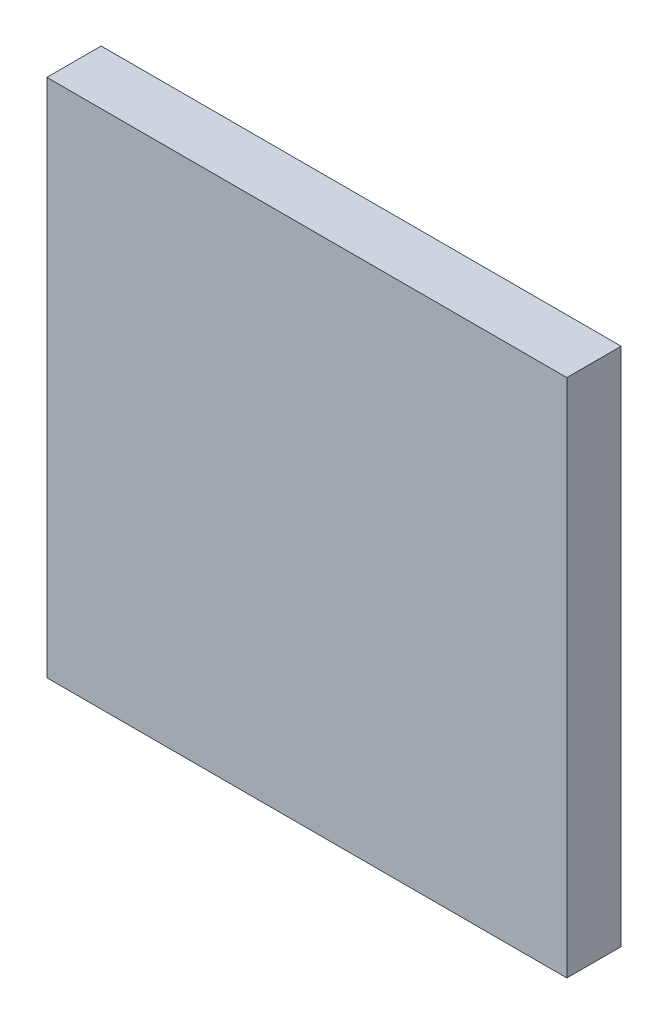
ISO-10303-21;
HEADER;
FILE_DESCRIPTION(('STEP AP214'),'2;1');
FILE_NAME('part.step','',(''),(''),'','','');
FILE_SCHEMA(('AUTOMOTIVE_DESIGN { 1 0 10303 214 1 1 1 1 }'));
ENDSEC;
DATA;
#1=APPLICATION_CONTEXT('core data for automotive mechanical design processes');
#2=APPLICATION_PROTOCOL_DEFINITION('international standard','automotive_design',2000,#1);
#3=PRODUCT_CONTEXT('',#1,'mechanical');
#4=PRODUCT('Part','Part','',(#3));
#5=PRODUCT_RELATED_PRODUCT_CATEGORY('part','',(#4));
#6=PRODUCT_DEFINITION_FORMATION('','',#4);
#7=PRODUCT_DEFINITION_CONTEXT('part definition',#1,'design');
#8=PRODUCT_DEFINITION('design','',#6,#7);
#9=PRODUCT_DEFINITION_SHAPE('','',#8);
#10=(LENGTH_UNIT() NAMED_UNIT(*) SI_UNIT(.MILLI.,.METRE.));
#11=(NAMED_UNIT(*) PLANE_ANGLE_UNIT() SI_UNIT($,.RADIAN.));
#12=(NAMED_UNIT(*) SI_UNIT($,.STERADIAN.) SOLID_ANGLE_UNIT());
#13=UNCERTAINTY_MEASURE_WITH_UNIT(LENGTH_MEASURE(1.E-05),#10,'distance_accuracy_value','');
#14=(GEOMETRIC_REPRESENTATION_CONTEXT(3) GLOBAL_UNCERTAINTY_ASSIGNED_CONTEXT((#13)) GLOBAL_UNIT_ASSIGNED_CONTEXT((#10,
#11,#12)) REPRESENTATION_CONTEXT('',''));
#15=CARTESIAN_POINT('',(0.,0.,0.));
#16=DIRECTION('',(0.,0.,1.));
#17=DIRECTION('',(1.,0.,0.));
#18=AXIS2_PLACEMENT_3D('',#15,#16,#17);
#19=CARTESIAN_POINT('',(-4.5,4.5,0.9398));
#20=DIRECTION('',(1.,0.,0.));
#21=DIRECTION('',(0.,1.,0.));
#22=AXIS2_PLACEMENT_3D('',#19,#20,#21);
#23=PLANE('',#22);
#24=DIRECTION('',(0.,-1.,0.));
#25=VECTOR('',#24,1.);
#26=CARTESIAN_POINT('',(-4.5,4.5,0.));
#27=LINE('',#26,#25);
#28=CARTESIAN_POINT('',(-4.5,4.5,0.));
#29=VERTEX_POINT('',#28);
#30=CARTESIAN_POINT('',(-4.5,-4.5,0.));
#31=VERTEX_POINT('',#30);
#32=EDGE_CURVE('E106',#29,#31,#27,.T.);
#33=ORIENTED_EDGE('',*,*,#32,.T.);
#34=DIRECTION('',(0.,0.,-1.));
#35=VECTOR('',#34,1.);
#36=CARTESIAN_POINT('',(-4.5,-4.5,0.9398));
#37=LINE('',#36,#35);
#38=CARTESIAN_POINT('',(-4.5,-4.5,0.9398));
#39=VERTEX_POINT('',#38);
#40=EDGE_CURVE('E11',#39,#31,#37,.T.);
#41=ORIENTED_EDGE('',*,*,#40,.F.);
#42=DIRECTION('',(0.,-1.,0.));
#43=VECTOR('',#42,1.);
#44=CARTESIAN_POINT('',(-4.5,4.5,0.9398));
#45=LINE('',#44,#43);
#46=CARTESIAN_POINT('',(-4.5,4.5,0.9398));
#47=VERTEX_POINT('',#46);
#48=EDGE_CURVE('E90',#47,#39,#45,.T.);
#49=ORIENTED_EDGE('',*,*,#48,.F.);
#50=DIRECTION('',(0.,0.,-1.));
#51=VECTOR('',#50,1.);
#52=CARTESIAN_POINT('',(-4.5,4.5,0.9398));
#53=LINE('',#52,#51);
#54=EDGE_CURVE('E102',#47,#29,#53,.T.);
#55=ORIENTED_EDGE('',*,*,#54,.T.);
#56=EDGE_LOOP('',(#33,#41,#49,#55));
#57=FACE_BOUND('',#56,.T.);
#58=ADVANCED_FACE('F39',(#57),#23,.F.);
#59=CARTESIAN_POINT('',(-4.5,-4.5,0.9398));
#60=DIRECTION('',(0.,1.,0.));
#61=DIRECTION('',(0.,0.,1.));
#62=AXIS2_PLACEMENT_3D('',#59,#60,#61);
#63=PLANE('',#62);
#64=DIRECTION('',(1.,0.,0.));
#65=VECTOR('',#64,1.);
#66=CARTESIAN_POINT('',(-4.5,-4.5,0.));
#67=LINE('',#66,#65);
#68=CARTESIAN_POINT('',(4.5,-4.5,0.));
#69=VERTEX_POINT('',#68);
#70=EDGE_CURVE('E95',#31,#69,#67,.T.);
#71=ORIENTED_EDGE('',*,*,#70,.T.);
#72=DIRECTION('',(0.,0.,-1.));
#73=VECTOR('',#72,1.);
#74=CARTESIAN_POINT('',(4.5,-4.5,0.9398));
#75=LINE('',#74,#73);
#76=CARTESIAN_POINT('',(4.5,-4.5,0.9398));
#77=VERTEX_POINT('',#76);
#78=EDGE_CURVE('E47',#77,#69,#75,.T.);
#79=ORIENTED_EDGE('',*,*,#78,.F.);
#80=DIRECTION('',(1.,0.,0.));
#81=VECTOR('',#80,1.);
#82=CARTESIAN_POINT('',(-4.5,-4.5,0.9398));
#83=LINE('',#82,#81);
#84=EDGE_CURVE('E85',#39,#77,#83,.T.);
#85=ORIENTED_EDGE('',*,*,#84,.F.);
#86=ORIENTED_EDGE('',*,*,#40,.T.);
#87=EDGE_LOOP('',(#71,#79,#85,#86));
#88=FACE_BOUND('',#87,.T.);
#89=ADVANCED_FACE('F94',(#88),#63,.F.);
#90=CARTESIAN_POINT('',(4.5,4.5,0.9398));
#91=DIRECTION('',(-1.,0.,0.));
#92=DIRECTION('',(0.,-1.,0.));
#93=AXIS2_PLACEMENT_3D('',#90,#91,#92);
#94=PLANE('',#93);
#95=DIRECTION('',(0.,1.,0.));
#96=VECTOR('',#95,1.);
#97=CARTESIAN_POINT('',(4.5,4.5,0.));
#98=LINE('',#97,#96);
#99=CARTESIAN_POINT('',(4.5,4.5,0.));
#100=VERTEX_POINT('',#99);
#101=EDGE_CURVE('E72',#69,#100,#98,.T.);
#102=ORIENTED_EDGE('',*,*,#101,.T.);
#103=DIRECTION('',(0.,0.,-1.));
#104=VECTOR('',#103,1.);
#105=CARTESIAN_POINT('',(4.5,4.5,0.9398));
#106=LINE('',#105,#104);
#107=CARTESIAN_POINT('',(4.5,4.5,0.9398));
#108=VERTEX_POINT('',#107);
#109=EDGE_CURVE('E97',#108,#100,#106,.T.);
#110=ORIENTED_EDGE('',*,*,#109,.F.);
#111=DIRECTION('',(0.,1.,0.));
#112=VECTOR('',#111,1.);
#113=CARTESIAN_POINT('',(4.5,4.5,0.9398));
#114=LINE('',#113,#112);
#115=EDGE_CURVE('E88',#77,#108,#114,.T.);
#116=ORIENTED_EDGE('',*,*,#115,.F.);
#117=ORIENTED_EDGE('',*,*,#78,.T.);
#118=EDGE_LOOP('',(#102,#110,#116,#117));
#119=FACE_BOUND('',#118,.T.);
#120=ADVANCED_FACE('F98',(#119),#94,.F.);
#121=CARTESIAN_POINT('',(-4.5,4.5,0.9398));
#122=DIRECTION('',(0.,-1.,0.));
#123=DIRECTION('',(1.,0.,0.));
#124=AXIS2_PLACEMENT_3D('',#121,#122,#123);
#125=PLANE('',#124);
#126=DIRECTION('',(-1.,0.,0.));
#127=VECTOR('',#126,1.);
#128=CARTESIAN_POINT('',(-4.5,4.5,0.));
#129=LINE('',#128,#127);
#130=EDGE_CURVE('E78',#100,#29,#129,.T.);
#131=ORIENTED_EDGE('',*,*,#130,.T.);
#132=ORIENTED_EDGE('',*,*,#54,.F.);
#133=DIRECTION('',(-1.,0.,0.));
#134=VECTOR('',#133,1.);
#135=CARTESIAN_POINT('',(-4.5,4.5,0.9398));
#136=LINE('',#135,#134);
#137=EDGE_CURVE('E55',#108,#47,#136,.T.);
#138=ORIENTED_EDGE('',*,*,#137,.F.);
#139=ORIENTED_EDGE('',*,*,#109,.T.);
#140=EDGE_LOOP('',(#131,#132,#138,#139));
#141=FACE_BOUND('',#140,.T.);
#142=ADVANCED_FACE('F117',(#141),#125,.F.);
#143=CARTESIAN_POINT('',(0.,0.,0.9398));
#144=DIRECTION('',(0.,0.,1.));
#145=DIRECTION('',(1.,0.,0.));
#146=AXIS2_PLACEMENT_3D('',#143,#144,#145);
#147=PLANE('',#146);
#148=ORIENTED_EDGE('',*,*,#48,.T.);
#149=ORIENTED_EDGE('',*,*,#84,.T.);
#150=ORIENTED_EDGE('',*,*,#115,.T.);
#151=ORIENTED_EDGE('',*,*,#137,.T.);
#152=EDGE_LOOP('',(#148,#149,#150,#151));
#153=FACE_BOUND('',#152,.T.);
#154=ADVANCED_FACE('F86',(#153),#147,.T.);
#155=CARTESIAN_POINT('',(0.,0.,0.));
#156=DIRECTION('',(0.,0.,1.));
#157=DIRECTION('',(1.,0.,0.));
#158=AXIS2_PLACEMENT_3D('',#155,#156,#157);
#159=PLANE('',#158);
#160=ORIENTED_EDGE('',*,*,#32,.F.);
#161=ORIENTED_EDGE('',*,*,#130,.F.);
#162=ORIENTED_EDGE('',*,*,#101,.F.);
#163=ORIENTED_EDGE('',*,*,#70,.F.);
#164=EDGE_LOOP('',(#160,#161,#162,#163));
#165=FACE_BOUND('',#164,.T.);
#166=ADVANCED_FACE('F120',(#165),#159,.F.);
#167=CLOSED_SHELL('',(#58,#89,#120,#142,#154,#166));
#168=MANIFOLD_SOLID_BREP('B2',#167);
#169=ADVANCED_BREP_SHAPE_REPRESENTATION('',(#18,#168),#14);
#170=SHAPE_DEFINITION_REPRESENTATION(#9,#169);
ENDSEC;
END-ISO-10303-21;
